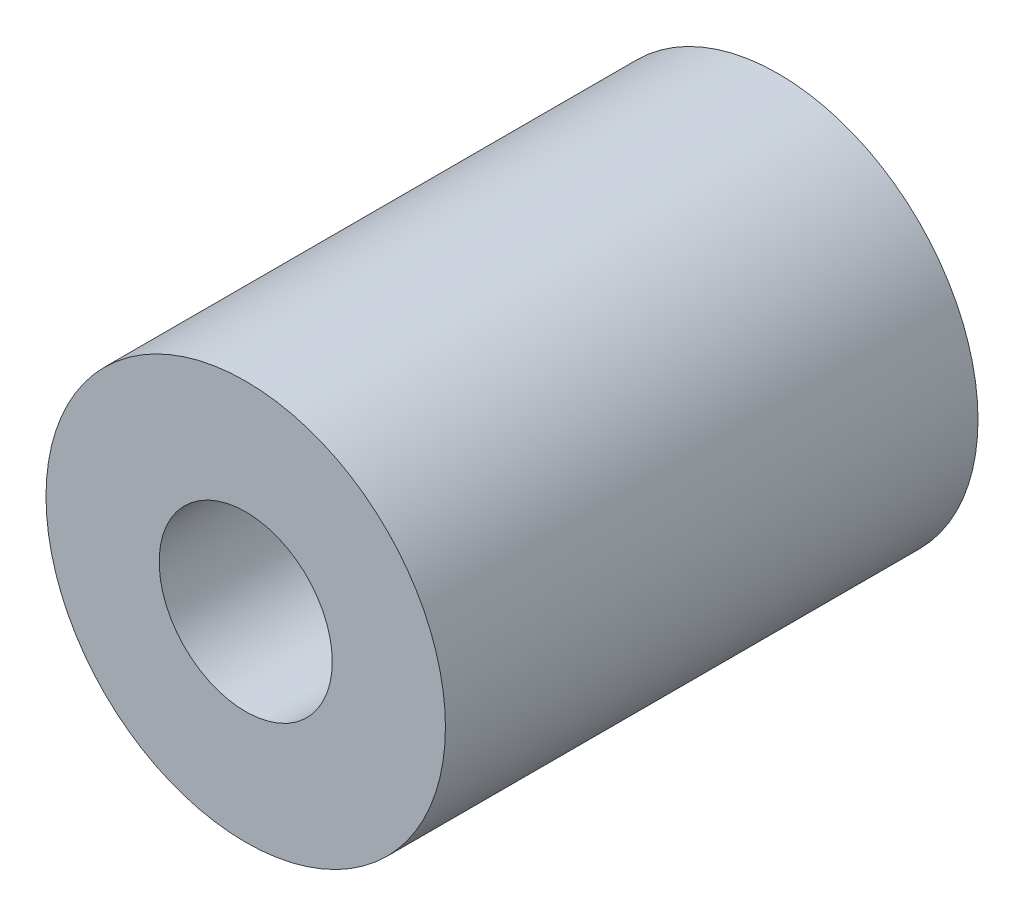
ISO-10303-21;
HEADER;
FILE_DESCRIPTION(('STEP AP214'),'2;1');
FILE_NAME('part.step','',(''),(''),'','','');
FILE_SCHEMA(('AUTOMOTIVE_DESIGN { 1 0 10303 214 1 1 1 1 }'));
ENDSEC;
DATA;
#1=APPLICATION_CONTEXT('core data for automotive mechanical design processes');
#2=APPLICATION_PROTOCOL_DEFINITION('international standard','automotive_design',2000,#1);
#3=PRODUCT_CONTEXT('',#1,'mechanical');
#4=PRODUCT('Part','Part','',(#3));
#5=PRODUCT_RELATED_PRODUCT_CATEGORY('part','',(#4));
#6=PRODUCT_DEFINITION_FORMATION('','',#4);
#7=PRODUCT_DEFINITION_CONTEXT('part definition',#1,'design');
#8=PRODUCT_DEFINITION('design','',#6,#7);
#9=PRODUCT_DEFINITION_SHAPE('','',#8);
#10=(LENGTH_UNIT() NAMED_UNIT(*) SI_UNIT(.MILLI.,.METRE.));
#11=(NAMED_UNIT(*) PLANE_ANGLE_UNIT() SI_UNIT($,.RADIAN.));
#12=(NAMED_UNIT(*) SI_UNIT($,.STERADIAN.) SOLID_ANGLE_UNIT());
#13=UNCERTAINTY_MEASURE_WITH_UNIT(LENGTH_MEASURE(1.E-05),#10,'distance_accuracy_value','');
#14=(GEOMETRIC_REPRESENTATION_CONTEXT(3) GLOBAL_UNCERTAINTY_ASSIGNED_CONTEXT((#13)) GLOBAL_UNIT_ASSIGNED_CONTEXT((#10,
#11,#12)) REPRESENTATION_CONTEXT('',''));
#15=CARTESIAN_POINT('',(0.,0.,0.));
#16=DIRECTION('',(0.,0.,1.));
#17=DIRECTION('',(1.,0.,0.));
#18=AXIS2_PLACEMENT_3D('',#15,#16,#17);
#19=CARTESIAN_POINT('',(0.,0.,8.));
#20=DIRECTION('',(0.,0.,1.));
#21=DIRECTION('',(1.,0.,0.));
#22=AXIS2_PLACEMENT_3D('',#19,#20,#21);
#23=PLANE('',#22);
#24=CARTESIAN_POINT('',(0.,0.,8.));
#25=DIRECTION('',(0.,0.,1.));
#26=DIRECTION('',(1.,0.,0.));
#27=AXIS2_PLACEMENT_3D('',#24,#25,#26);
#28=CIRCLE('',#27,3.);
#29=CARTESIAN_POINT('',(3.,0.,8.));
#30=VERTEX_POINT('',#29);
#31=EDGE_CURVE('E10',#30,#30,#28,.T.);
#32=ORIENTED_EDGE('',*,*,#31,.T.);
#33=EDGE_LOOP('',(#32));
#34=FACE_BOUND('',#33,.T.);
#35=CARTESIAN_POINT('',(0.,0.,8.));
#36=DIRECTION('',(0.,0.,1.));
#37=DIRECTION('',(1.,0.,0.));
#38=AXIS2_PLACEMENT_3D('',#35,#36,#37);
#39=CIRCLE('',#38,1.3);
#40=CARTESIAN_POINT('',(1.3,0.,8.));
#41=VERTEX_POINT('',#40);
#42=EDGE_CURVE('E42',#41,#41,#39,.T.);
#43=ORIENTED_EDGE('',*,*,#42,.F.);
#44=EDGE_LOOP('',(#43));
#45=FACE_BOUND('',#44,.T.);
#46=ADVANCED_FACE('F31',(#34,#45),#23,.T.);
#47=CARTESIAN_POINT('',(0.,0.,0.));
#48=DIRECTION('',(0.,0.,1.));
#49=DIRECTION('',(1.,0.,0.));
#50=AXIS2_PLACEMENT_3D('',#47,#48,#49);
#51=PLANE('',#50);
#52=CARTESIAN_POINT('',(0.,0.,0.));
#53=DIRECTION('',(0.,0.,1.));
#54=DIRECTION('',(1.,0.,0.));
#55=AXIS2_PLACEMENT_3D('',#52,#53,#54);
#56=CIRCLE('',#55,3.);
#57=CARTESIAN_POINT('',(3.,0.,0.));
#58=VERTEX_POINT('',#57);
#59=EDGE_CURVE('E35',#58,#58,#56,.T.);
#60=ORIENTED_EDGE('',*,*,#59,.F.);
#61=EDGE_LOOP('',(#60));
#62=FACE_BOUND('',#61,.T.);
#63=CARTESIAN_POINT('',(0.,0.,0.));
#64=DIRECTION('',(0.,0.,1.));
#65=DIRECTION('',(1.,0.,0.));
#66=AXIS2_PLACEMENT_3D('',#63,#64,#65);
#67=CIRCLE('',#66,1.3);
#68=CARTESIAN_POINT('',(1.3,0.,0.));
#69=VERTEX_POINT('',#68);
#70=EDGE_CURVE('E44',#69,#69,#67,.T.);
#71=ORIENTED_EDGE('',*,*,#70,.T.);
#72=EDGE_LOOP('',(#71));
#73=FACE_BOUND('',#72,.T.);
#74=ADVANCED_FACE('F54',(#62,#73),#51,.F.);
#75=CARTESIAN_POINT('',(0.,0.,8.));
#76=DIRECTION('',(0.,0.,-1.));
#77=DIRECTION('',(-1.,0.,0.));
#78=AXIS2_PLACEMENT_3D('',#75,#76,#77);
#79=CYLINDRICAL_SURFACE('',#78,3.);
#80=ORIENTED_EDGE('',*,*,#31,.F.);
#81=EDGE_LOOP('',(#80));
#82=FACE_BOUND('',#81,.T.);
#83=ORIENTED_EDGE('',*,*,#59,.T.);
#84=EDGE_LOOP('',(#83));
#85=FACE_BOUND('',#84,.T.);
#86=ADVANCED_FACE('F33',(#82,#85),#79,.T.);
#87=CARTESIAN_POINT('',(0.,0.,8.));
#88=DIRECTION('',(0.,0.,-1.));
#89=DIRECTION('',(-1.,0.,0.));
#90=AXIS2_PLACEMENT_3D('',#87,#88,#89);
#91=CYLINDRICAL_SURFACE('',#90,1.3);
#92=ORIENTED_EDGE('',*,*,#42,.T.);
#93=EDGE_LOOP('',(#92));
#94=FACE_BOUND('',#93,.T.);
#95=ORIENTED_EDGE('',*,*,#70,.F.);
#96=EDGE_LOOP('',(#95));
#97=FACE_BOUND('',#96,.T.);
#98=ADVANCED_FACE('F50',(#94,#97),#91,.F.);
#99=CLOSED_SHELL('',(#46,#74,#86,#98));
#100=MANIFOLD_SOLID_BREP('B2',#99);
#101=ADVANCED_BREP_SHAPE_REPRESENTATION('',(#18,#100),#14);
#102=SHAPE_DEFINITION_REPRESENTATION(#9,#101);
ENDSEC;
END-ISO-10303-21;
